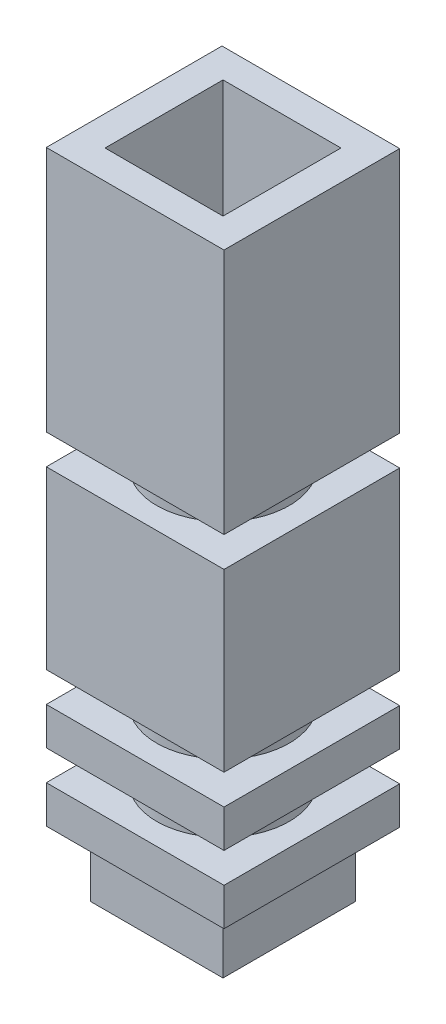
ISO-10303-21;
HEADER;
FILE_DESCRIPTION(('STEP AP214'),'2;1');
FILE_NAME('part.step','',(''),(''),'','','');
FILE_SCHEMA(('AUTOMOTIVE_DESIGN { 1 0 10303 214 1 1 1 1 }'));
ENDSEC;
DATA;
#1=APPLICATION_CONTEXT('core data for automotive mechanical design processes');
#2=APPLICATION_PROTOCOL_DEFINITION('international standard','automotive_design',2000,#1);
#3=PRODUCT_CONTEXT('',#1,'mechanical');
#4=PRODUCT('Part','Part','',(#3));
#5=PRODUCT_RELATED_PRODUCT_CATEGORY('part','',(#4));
#6=PRODUCT_DEFINITION_FORMATION('','',#4);
#7=PRODUCT_DEFINITION_CONTEXT('part definition',#1,'design');
#8=PRODUCT_DEFINITION('design','',#6,#7);
#9=PRODUCT_DEFINITION_SHAPE('','',#8);
#10=(LENGTH_UNIT() NAMED_UNIT(*) SI_UNIT(.MILLI.,.METRE.));
#11=(NAMED_UNIT(*) PLANE_ANGLE_UNIT() SI_UNIT($,.RADIAN.));
#12=(NAMED_UNIT(*) SI_UNIT($,.STERADIAN.) SOLID_ANGLE_UNIT());
#13=UNCERTAINTY_MEASURE_WITH_UNIT(LENGTH_MEASURE(1.E-05),#10,'distance_accuracy_value','');
#14=(GEOMETRIC_REPRESENTATION_CONTEXT(3) GLOBAL_UNCERTAINTY_ASSIGNED_CONTEXT((#13)) GLOBAL_UNIT_ASSIGNED_CONTEXT((#10,
#11,#12)) REPRESENTATION_CONTEXT('',''));
#15=CARTESIAN_POINT('',(0.,0.,0.));
#16=DIRECTION('',(0.,0.,1.));
#17=DIRECTION('',(1.,0.,0.));
#18=AXIS2_PLACEMENT_3D('',#15,#16,#17);
#19=CARTESIAN_POINT('',(0.,3.27659999999999,4.445));
#20=DIRECTION('',(0.,1.,0.));
#21=DIRECTION('',(0.,0.,1.));
#22=AXIS2_PLACEMENT_3D('',#19,#20,#21);
#23=PLANE('',#22);
#24=DIRECTION('',(1.,0.,0.));
#25=VECTOR('',#24,1.);
#26=CARTESIAN_POINT('',(0.,3.27659999999999,-4.445));
#27=LINE('',#26,#25);
#28=CARTESIAN_POINT('',(-4.49580000000001,3.27659999999999,-4.445));
#29=VERTEX_POINT('',#28);
#30=CARTESIAN_POINT('',(4.49579999999999,3.27659999999999,-4.445));
#31=VERTEX_POINT('',#30);
#32=EDGE_CURVE('E378',#29,#31,#27,.T.);
#33=ORIENTED_EDGE('',*,*,#32,.T.);
#34=DIRECTION('',(0.,0.,-1.));
#35=VECTOR('',#34,1.);
#36=CARTESIAN_POINT('',(4.49579999999999,3.27659999999999,4.445));
#37=LINE('',#36,#35);
#38=CARTESIAN_POINT('',(4.49579999999999,3.27659999999999,4.445));
#39=VERTEX_POINT('',#38);
#40=EDGE_CURVE('E385',#39,#31,#37,.T.);
#41=ORIENTED_EDGE('',*,*,#40,.F.);
#42=DIRECTION('',(1.,0.,0.));
#43=VECTOR('',#42,1.);
#44=CARTESIAN_POINT('',(0.,3.27659999999999,4.445));
#45=LINE('',#44,#43);
#46=CARTESIAN_POINT('',(-4.49580000000001,3.27659999999999,4.445));
#47=VERTEX_POINT('',#46);
#48=EDGE_CURVE('E383',#47,#39,#45,.T.);
#49=ORIENTED_EDGE('',*,*,#48,.F.);
#50=DIRECTION('',(0.,0.,-1.));
#51=VECTOR('',#50,1.);
#52=CARTESIAN_POINT('',(-4.49580000000001,3.27659999999999,4.445));
#53=LINE('',#52,#51);
#54=EDGE_CURVE('E396',#47,#29,#53,.T.);
#55=ORIENTED_EDGE('',*,*,#54,.T.);
#56=EDGE_LOOP('',(#33,#41,#49,#55));
#57=FACE_BOUND('',#56,.T.);
#58=DIRECTION('',(1.,0.,0.));
#59=VECTOR('',#58,1.);
#60=CARTESIAN_POINT('',(0.,3.27659999999999,-3.3528));
#61=LINE('',#60,#59);
#62=CARTESIAN_POINT('',(-3.3528,3.27659999999999,-3.3528));
#63=VERTEX_POINT('',#62);
#64=CARTESIAN_POINT('',(3.3528,3.27659999999999,-3.3528));
#65=VERTEX_POINT('',#64);
#66=EDGE_CURVE('E60',#63,#65,#61,.T.);
#67=ORIENTED_EDGE('',*,*,#66,.F.);
#68=DIRECTION('',(0.,0.,-1.));
#69=VECTOR('',#68,1.);
#70=CARTESIAN_POINT('',(-3.3528,3.27659999999999,3.3528));
#71=LINE('',#70,#69);
#72=CARTESIAN_POINT('',(-3.3528,3.27659999999999,3.3528));
#73=VERTEX_POINT('',#72);
#74=EDGE_CURVE('E264',#73,#63,#71,.T.);
#75=ORIENTED_EDGE('',*,*,#74,.F.);
#76=DIRECTION('',(1.,0.,0.));
#77=VECTOR('',#76,1.);
#78=CARTESIAN_POINT('',(0.,3.27659999999999,3.3528));
#79=LINE('',#78,#77);
#80=CARTESIAN_POINT('',(3.3528,3.27659999999999,3.3528));
#81=VERTEX_POINT('',#80);
#82=EDGE_CURVE('E245',#73,#81,#79,.T.);
#83=ORIENTED_EDGE('',*,*,#82,.T.);
#84=DIRECTION('',(0.,0.,-1.));
#85=VECTOR('',#84,1.);
#86=CARTESIAN_POINT('',(3.3528,3.27659999999999,3.3528));
#87=LINE('',#86,#85);
#88=EDGE_CURVE('E266',#81,#65,#87,.T.);
#89=ORIENTED_EDGE('',*,*,#88,.T.);
#90=EDGE_LOOP('',(#67,#75,#83,#89));
#91=FACE_BOUND('',#90,.T.);
#92=ADVANCED_FACE('F35',(#57,#91),#23,.F.);
#93=CARTESIAN_POINT('',(4.49579999999999,0.,4.445));
#94=DIRECTION('',(1.,0.,0.));
#95=DIRECTION('',(0.,0.,-1.));
#96=AXIS2_PLACEMENT_3D('',#93,#94,#95);
#97=PLANE('',#96);
#98=DIRECTION('',(0.,-1.,0.));
#99=VECTOR('',#98,1.);
#100=CARTESIAN_POINT('',(4.49579999999999,0.,-4.445));
#101=LINE('',#100,#99);
#102=CARTESIAN_POINT('',(4.49579999999999,5.18159999999999,-4.445));
#103=VERTEX_POINT('',#102);
#104=EDGE_CURVE('E373',#103,#31,#101,.T.);
#105=ORIENTED_EDGE('',*,*,#104,.F.);
#106=DIRECTION('',(0.,0.,-1.));
#107=VECTOR('',#106,1.);
#108=CARTESIAN_POINT('',(4.49579999999999,5.18159999999999,4.445));
#109=LINE('',#108,#107);
#110=CARTESIAN_POINT('',(4.49579999999999,5.18159999999999,4.445));
#111=VERTEX_POINT('',#110);
#112=EDGE_CURVE('E39',#111,#103,#109,.T.);
#113=ORIENTED_EDGE('',*,*,#112,.F.);
#114=DIRECTION('',(0.,-1.,0.));
#115=VECTOR('',#114,1.);
#116=CARTESIAN_POINT('',(4.49579999999999,0.,4.445));
#117=LINE('',#116,#115);
#118=EDGE_CURVE('E374',#111,#39,#117,.T.);
#119=ORIENTED_EDGE('',*,*,#118,.T.);
#120=ORIENTED_EDGE('',*,*,#40,.T.);
#121=EDGE_LOOP('',(#105,#113,#119,#120));
#122=FACE_BOUND('',#121,.T.);
#123=ADVANCED_FACE('F37',(#122),#97,.T.);
#124=CARTESIAN_POINT('',(0.,5.18159999999999,4.445));
#125=DIRECTION('',(0.,1.,0.));
#126=DIRECTION('',(-1.,0.,0.));
#127=AXIS2_PLACEMENT_3D('',#124,#125,#126);
#128=PLANE('',#127);
#129=CARTESIAN_POINT('',(0.,5.18159999999996,0.));
#130=DIRECTION('',(0.,1.,0.));
#131=DIRECTION('',(-1.,0.,0.));
#132=AXIS2_PLACEMENT_3D('',#129,#130,#131);
#133=CIRCLE('',#132,3.35279999999999);
#134=CARTESIAN_POINT('',(-3.3528,5.18159999999999,0.));
#135=VERTEX_POINT('',#134);
#136=EDGE_CURVE('E335',#135,#135,#133,.T.);
#137=ORIENTED_EDGE('',*,*,#136,.F.);
#138=EDGE_LOOP('',(#137));
#139=FACE_BOUND('',#138,.T.);
#140=DIRECTION('',(1.,0.,0.));
#141=VECTOR('',#140,1.);
#142=CARTESIAN_POINT('',(0.,5.18159999999999,-4.445));
#143=LINE('',#142,#141);
#144=CARTESIAN_POINT('',(-4.49580000000001,5.18159999999999,-4.445));
#145=VERTEX_POINT('',#144);
#146=EDGE_CURVE('E388',#145,#103,#143,.T.);
#147=ORIENTED_EDGE('',*,*,#146,.F.);
#148=DIRECTION('',(0.,0.,-1.));
#149=VECTOR('',#148,1.);
#150=CARTESIAN_POINT('',(-4.49580000000001,5.18159999999999,4.445));
#151=LINE('',#150,#149);
#152=CARTESIAN_POINT('',(-4.49580000000001,5.18159999999999,4.445));
#153=VERTEX_POINT('',#152);
#154=EDGE_CURVE('E398',#153,#145,#151,.T.);
#155=ORIENTED_EDGE('',*,*,#154,.F.);
#156=DIRECTION('',(1.,0.,0.));
#157=VECTOR('',#156,1.);
#158=CARTESIAN_POINT('',(0.,5.18159999999999,4.445));
#159=LINE('',#158,#157);
#160=EDGE_CURVE('E377',#153,#111,#159,.T.);
#161=ORIENTED_EDGE('',*,*,#160,.T.);
#162=ORIENTED_EDGE('',*,*,#112,.T.);
#163=EDGE_LOOP('',(#147,#155,#161,#162));
#164=FACE_BOUND('',#163,.T.);
#165=ADVANCED_FACE('F405',(#139,#164),#128,.T.);
#166=CARTESIAN_POINT('',(-4.49580000000001,0.,4.445));
#167=DIRECTION('',(1.,0.,0.));
#168=DIRECTION('',(0.,0.,-1.));
#169=AXIS2_PLACEMENT_3D('',#166,#167,#168);
#170=PLANE('',#169);
#171=DIRECTION('',(0.,-1.,0.));
#172=VECTOR('',#171,1.);
#173=CARTESIAN_POINT('',(-4.49580000000001,0.,-4.445));
#174=LINE('',#173,#172);
#175=EDGE_CURVE('E391',#145,#29,#174,.T.);
#176=ORIENTED_EDGE('',*,*,#175,.T.);
#177=ORIENTED_EDGE('',*,*,#54,.F.);
#178=DIRECTION('',(0.,-1.,0.));
#179=VECTOR('',#178,1.);
#180=CARTESIAN_POINT('',(-4.49580000000001,0.,4.445));
#181=LINE('',#180,#179);
#182=EDGE_CURVE('E381',#153,#47,#181,.T.);
#183=ORIENTED_EDGE('',*,*,#182,.F.);
#184=ORIENTED_EDGE('',*,*,#154,.T.);
#185=EDGE_LOOP('',(#176,#177,#183,#184));
#186=FACE_BOUND('',#185,.T.);
#187=ADVANCED_FACE('F414',(#186),#170,.F.);
#188=CARTESIAN_POINT('',(0.,0.,4.445));
#189=DIRECTION('',(0.,0.,1.));
#190=DIRECTION('',(1.,0.,0.));
#191=AXIS2_PLACEMENT_3D('',#188,#189,#190);
#192=PLANE('',#191);
#193=ORIENTED_EDGE('',*,*,#118,.F.);
#194=ORIENTED_EDGE('',*,*,#160,.F.);
#195=ORIENTED_EDGE('',*,*,#182,.T.);
#196=ORIENTED_EDGE('',*,*,#48,.T.);
#197=EDGE_LOOP('',(#193,#194,#195,#196));
#198=FACE_BOUND('',#197,.T.);
#199=ADVANCED_FACE('F419',(#198),#192,.T.);
#200=CARTESIAN_POINT('',(0.,0.,-4.445));
#201=DIRECTION('',(0.,0.,1.));
#202=DIRECTION('',(1.,0.,0.));
#203=AXIS2_PLACEMENT_3D('',#200,#201,#202);
#204=PLANE('',#203);
#205=ORIENTED_EDGE('',*,*,#104,.T.);
#206=ORIENTED_EDGE('',*,*,#32,.F.);
#207=ORIENTED_EDGE('',*,*,#175,.F.);
#208=ORIENTED_EDGE('',*,*,#146,.T.);
#209=EDGE_LOOP('',(#205,#206,#207,#208));
#210=FACE_BOUND('',#209,.T.);
#211=ADVANCED_FACE('F412',(#210),#204,.F.);
#212=CARTESIAN_POINT('',(0.,6.70559999999999,0.));
#213=DIRECTION('',(0.,1.,0.));
#214=DIRECTION('',(-1.,0.,0.));
#215=AXIS2_PLACEMENT_3D('',#212,#213,#214);
#216=CYLINDRICAL_SURFACE('',#215,3.3528);
#217=ORIENTED_EDGE('',*,*,#136,.T.);
#218=EDGE_LOOP('',(#217));
#219=FACE_BOUND('',#218,.T.);
#220=CARTESIAN_POINT('',(0.,6.70559999999997,0.));
#221=DIRECTION('',(0.,1.,0.));
#222=DIRECTION('',(-1.,0.,0.));
#223=AXIS2_PLACEMENT_3D('',#220,#221,#222);
#224=CIRCLE('',#223,3.3528);
#225=CARTESIAN_POINT('',(-3.3528,6.70559999999999,0.));
#226=VERTEX_POINT('',#225);
#227=EDGE_CURVE('E368',#226,#226,#224,.T.);
#228=ORIENTED_EDGE('',*,*,#227,.F.);
#229=EDGE_LOOP('',(#228));
#230=FACE_BOUND('',#229,.T.);
#231=ADVANCED_FACE('F426',(#219,#230),#216,.T.);
#232=CARTESIAN_POINT('',(4.4958,0.,4.445));
#233=DIRECTION('',(1.,0.,0.));
#234=DIRECTION('',(0.,0.,-1.));
#235=AXIS2_PLACEMENT_3D('',#232,#233,#234);
#236=PLANE('',#235);
#237=DIRECTION('',(0.,-1.,0.));
#238=VECTOR('',#237,1.);
#239=CARTESIAN_POINT('',(4.4958,0.,-4.445));
#240=LINE('',#239,#238);
#241=CARTESIAN_POINT('',(4.4958,8.61059999999999,-4.445));
#242=VERTEX_POINT('',#241);
#243=CARTESIAN_POINT('',(4.4958,6.70559999999999,-4.445));
#244=VERTEX_POINT('',#243);
#245=EDGE_CURVE('E338',#242,#244,#240,.T.);
#246=ORIENTED_EDGE('',*,*,#245,.F.);
#247=DIRECTION('',(0.,0.,-1.));
#248=VECTOR('',#247,1.);
#249=CARTESIAN_POINT('',(4.4958,8.61059999999999,4.445));
#250=LINE('',#249,#248);
#251=CARTESIAN_POINT('',(4.4958,8.61059999999999,4.445));
#252=VERTEX_POINT('',#251);
#253=EDGE_CURVE('E366',#252,#242,#250,.T.);
#254=ORIENTED_EDGE('',*,*,#253,.F.);
#255=DIRECTION('',(0.,-1.,0.));
#256=VECTOR('',#255,1.);
#257=CARTESIAN_POINT('',(4.4958,0.,4.445));
#258=LINE('',#257,#256);
#259=CARTESIAN_POINT('',(4.4958,6.70559999999999,4.445));
#260=VERTEX_POINT('',#259);
#261=EDGE_CURVE('E339',#252,#260,#258,.T.);
#262=ORIENTED_EDGE('',*,*,#261,.T.);
#263=DIRECTION('',(0.,0.,-1.));
#264=VECTOR('',#263,1.);
#265=CARTESIAN_POINT('',(4.4958,6.70559999999999,4.445));
#266=LINE('',#265,#264);
#267=EDGE_CURVE('E350',#260,#244,#266,.T.);
#268=ORIENTED_EDGE('',*,*,#267,.T.);
#269=EDGE_LOOP('',(#246,#254,#262,#268));
#270=FACE_BOUND('',#269,.T.);
#271=ADVANCED_FACE('F443',(#270),#236,.T.);
#272=CARTESIAN_POINT('',(0.,8.61059999999999,4.445));
#273=DIRECTION('',(0.,1.,0.));
#274=DIRECTION('',(0.,0.,1.));
#275=AXIS2_PLACEMENT_3D('',#272,#273,#274);
#276=PLANE('',#275);
#277=CARTESIAN_POINT('',(0.,8.6106,0.));
#278=DIRECTION('',(0.,1.,0.));
#279=DIRECTION('',(-1.,0.,0.));
#280=AXIS2_PLACEMENT_3D('',#277,#278,#279);
#281=CIRCLE('',#280,3.3528);
#282=CARTESIAN_POINT('',(-3.3528,8.61059999999999,0.));
#283=VERTEX_POINT('',#282);
#284=EDGE_CURVE('E44',#283,#283,#281,.T.);
#285=ORIENTED_EDGE('',*,*,#284,.F.);
#286=EDGE_LOOP('',(#285));
#287=FACE_BOUND('',#286,.T.);
#288=DIRECTION('',(1.,0.,0.));
#289=VECTOR('',#288,1.);
#290=CARTESIAN_POINT('',(0.,8.61059999999999,-4.445));
#291=LINE('',#290,#289);
#292=CARTESIAN_POINT('',(-4.4958,8.61059999999999,-4.445));
#293=VERTEX_POINT('',#292);
#294=EDGE_CURVE('E353',#293,#242,#291,.T.);
#295=ORIENTED_EDGE('',*,*,#294,.F.);
#296=DIRECTION('',(0.,0.,-1.));
#297=VECTOR('',#296,1.);
#298=CARTESIAN_POINT('',(-4.4958,8.61059999999999,4.445));
#299=LINE('',#298,#297);
#300=CARTESIAN_POINT('',(-4.4958,8.61059999999999,4.445));
#301=VERTEX_POINT('',#300);
#302=EDGE_CURVE('E364',#301,#293,#299,.T.);
#303=ORIENTED_EDGE('',*,*,#302,.F.);
#304=DIRECTION('',(1.,0.,0.));
#305=VECTOR('',#304,1.);
#306=CARTESIAN_POINT('',(0.,8.61059999999999,4.445));
#307=LINE('',#306,#305);
#308=EDGE_CURVE('E342',#301,#252,#307,.T.);
#309=ORIENTED_EDGE('',*,*,#308,.T.);
#310=ORIENTED_EDGE('',*,*,#253,.T.);
#311=EDGE_LOOP('',(#295,#303,#309,#310));
#312=FACE_BOUND('',#311,.T.);
#313=ADVANCED_FACE('F466',(#287,#312),#276,.T.);
#314=CARTESIAN_POINT('',(-4.4958,0.,4.445));
#315=DIRECTION('',(1.,0.,0.));
#316=DIRECTION('',(0.,0.,-1.));
#317=AXIS2_PLACEMENT_3D('',#314,#315,#316);
#318=PLANE('',#317);
#319=DIRECTION('',(0.,-1.,0.));
#320=VECTOR('',#319,1.);
#321=CARTESIAN_POINT('',(-4.4958,0.,-4.445));
#322=LINE('',#321,#320);
#323=CARTESIAN_POINT('',(-4.4958,6.70559999999999,-4.445));
#324=VERTEX_POINT('',#323);
#325=EDGE_CURVE('E356',#293,#324,#322,.T.);
#326=ORIENTED_EDGE('',*,*,#325,.T.);
#327=DIRECTION('',(0.,0.,-1.));
#328=VECTOR('',#327,1.);
#329=CARTESIAN_POINT('',(-4.4958,6.70559999999999,4.445));
#330=LINE('',#329,#328);
#331=CARTESIAN_POINT('',(-4.4958,6.70559999999999,4.445));
#332=VERTEX_POINT('',#331);
#333=EDGE_CURVE('E361',#332,#324,#330,.T.);
#334=ORIENTED_EDGE('',*,*,#333,.F.);
#335=DIRECTION('',(0.,-1.,0.));
#336=VECTOR('',#335,1.);
#337=CARTESIAN_POINT('',(-4.4958,0.,4.445));
#338=LINE('',#337,#336);
#339=EDGE_CURVE('E346',#301,#332,#338,.T.);
#340=ORIENTED_EDGE('',*,*,#339,.F.);
#341=ORIENTED_EDGE('',*,*,#302,.T.);
#342=EDGE_LOOP('',(#326,#334,#340,#341));
#343=FACE_BOUND('',#342,.T.);
#344=ADVANCED_FACE('F450',(#343),#318,.F.);
#345=CARTESIAN_POINT('',(0.,6.70559999999999,4.445));
#346=DIRECTION('',(0.,1.,0.));
#347=DIRECTION('',(-1.,0.,0.));
#348=AXIS2_PLACEMENT_3D('',#345,#346,#347);
#349=PLANE('',#348);
#350=ORIENTED_EDGE('',*,*,#227,.T.);
#351=EDGE_LOOP('',(#350));
#352=FACE_BOUND('',#351,.T.);
#353=DIRECTION('',(1.,0.,0.));
#354=VECTOR('',#353,1.);
#355=CARTESIAN_POINT('',(0.,6.70559999999999,-4.445));
#356=LINE('',#355,#354);
#357=EDGE_CURVE('E343',#324,#244,#356,.T.);
#358=ORIENTED_EDGE('',*,*,#357,.T.);
#359=ORIENTED_EDGE('',*,*,#267,.F.);
#360=DIRECTION('',(1.,0.,0.));
#361=VECTOR('',#360,1.);
#362=CARTESIAN_POINT('',(0.,6.70559999999999,4.445));
#363=LINE('',#362,#361);
#364=EDGE_CURVE('E348',#332,#260,#363,.T.);
#365=ORIENTED_EDGE('',*,*,#364,.F.);
#366=ORIENTED_EDGE('',*,*,#333,.T.);
#367=EDGE_LOOP('',(#358,#359,#365,#366));
#368=FACE_BOUND('',#367,.T.);
#369=ADVANCED_FACE('F446',(#352,#368),#349,.F.);
#370=CARTESIAN_POINT('',(0.,0.,4.445));
#371=DIRECTION('',(0.,0.,1.));
#372=DIRECTION('',(1.,0.,0.));
#373=AXIS2_PLACEMENT_3D('',#370,#371,#372);
#374=PLANE('',#373);
#375=ORIENTED_EDGE('',*,*,#261,.F.);
#376=ORIENTED_EDGE('',*,*,#308,.F.);
#377=ORIENTED_EDGE('',*,*,#339,.T.);
#378=ORIENTED_EDGE('',*,*,#364,.T.);
#379=EDGE_LOOP('',(#375,#376,#377,#378));
#380=FACE_BOUND('',#379,.T.);
#381=ADVANCED_FACE('F449',(#380),#374,.T.);
#382=CARTESIAN_POINT('',(0.,0.,-4.445));
#383=DIRECTION('',(0.,0.,1.));
#384=DIRECTION('',(1.,0.,0.));
#385=AXIS2_PLACEMENT_3D('',#382,#383,#384);
#386=PLANE('',#385);
#387=ORIENTED_EDGE('',*,*,#245,.T.);
#388=ORIENTED_EDGE('',*,*,#357,.F.);
#389=ORIENTED_EDGE('',*,*,#325,.F.);
#390=ORIENTED_EDGE('',*,*,#294,.T.);
#391=EDGE_LOOP('',(#387,#388,#389,#390));
#392=FACE_BOUND('',#391,.T.);
#393=ADVANCED_FACE('F459',(#392),#386,.F.);
#394=CARTESIAN_POINT('',(0.,10.1346,0.));
#395=DIRECTION('',(0.,1.,0.));
#396=DIRECTION('',(-1.,0.,0.));
#397=AXIS2_PLACEMENT_3D('',#394,#395,#396);
#398=CYLINDRICAL_SURFACE('',#397,3.3528);
#399=ORIENTED_EDGE('',*,*,#284,.T.);
#400=EDGE_LOOP('',(#399));
#401=FACE_BOUND('',#400,.T.);
#402=CARTESIAN_POINT('',(0.,10.1346,0.));
#403=DIRECTION('',(0.,1.,0.));
#404=DIRECTION('',(-1.,0.,0.));
#405=AXIS2_PLACEMENT_3D('',#402,#403,#404);
#406=CIRCLE('',#405,3.3528);
#407=CARTESIAN_POINT('',(-3.3528,10.1346,0.));
#408=VERTEX_POINT('',#407);
#409=EDGE_CURVE('E332',#408,#408,#406,.T.);
#410=ORIENTED_EDGE('',*,*,#409,.F.);
#411=EDGE_LOOP('',(#410));
#412=FACE_BOUND('',#411,.T.);
#413=ADVANCED_FACE('F499',(#401,#412),#398,.T.);
#414=CARTESIAN_POINT('',(4.4958,0.,4.445));
#415=DIRECTION('',(1.,0.,0.));
#416=DIRECTION('',(0.,0.,-1.));
#417=AXIS2_PLACEMENT_3D('',#414,#415,#416);
#418=PLANE('',#417);
#419=DIRECTION('',(0.,-1.,0.));
#420=VECTOR('',#419,1.);
#421=CARTESIAN_POINT('',(4.4958,0.,-4.445));
#422=LINE('',#421,#420);
#423=CARTESIAN_POINT('',(4.4958,19.0246,-4.445));
#424=VERTEX_POINT('',#423);
#425=CARTESIAN_POINT('',(4.4958,10.1346,-4.445));
#426=VERTEX_POINT('',#425);
#427=EDGE_CURVE('E302',#424,#426,#422,.T.);
#428=ORIENTED_EDGE('',*,*,#427,.F.);
#429=DIRECTION('',(0.,0.,-1.));
#430=VECTOR('',#429,1.);
#431=CARTESIAN_POINT('',(4.4958,19.0246,4.445));
#432=LINE('',#431,#430);
#433=CARTESIAN_POINT('',(4.4958,19.0246,4.445));
#434=VERTEX_POINT('',#433);
#435=EDGE_CURVE('E330',#434,#424,#432,.T.);
#436=ORIENTED_EDGE('',*,*,#435,.F.);
#437=DIRECTION('',(0.,-1.,0.));
#438=VECTOR('',#437,1.);
#439=CARTESIAN_POINT('',(4.4958,0.,4.445));
#440=LINE('',#439,#438);
#441=CARTESIAN_POINT('',(4.4958,10.1346,4.445));
#442=VERTEX_POINT('',#441);
#443=EDGE_CURVE('E303',#434,#442,#440,.T.);
#444=ORIENTED_EDGE('',*,*,#443,.T.);
#445=DIRECTION('',(0.,0.,-1.));
#446=VECTOR('',#445,1.);
#447=CARTESIAN_POINT('',(4.4958,10.1346,4.445));
#448=LINE('',#447,#446);
#449=EDGE_CURVE('E314',#442,#426,#448,.T.);
#450=ORIENTED_EDGE('',*,*,#449,.T.);
#451=EDGE_LOOP('',(#428,#436,#444,#450));
#452=FACE_BOUND('',#451,.T.);
#453=ADVANCED_FACE('F504',(#452),#418,.T.);
#454=CARTESIAN_POINT('',(0.,19.0246,4.445));
#455=DIRECTION('',(0.,1.,0.));
#456=DIRECTION('',(-1.,0.,0.));
#457=AXIS2_PLACEMENT_3D('',#454,#455,#456);
#458=PLANE('',#457);
#459=CARTESIAN_POINT('',(0.,19.0246,0.));
#460=DIRECTION('',(0.,1.,0.));
#461=DIRECTION('',(-1.,0.,0.));
#462=AXIS2_PLACEMENT_3D('',#459,#460,#461);
#463=CIRCLE('',#462,3.35280000000001);
#464=CARTESIAN_POINT('',(-3.35280000000001,19.0246,0.));
#465=VERTEX_POINT('',#464);
#466=EDGE_CURVE('E11',#465,#465,#463,.T.);
#467=ORIENTED_EDGE('',*,*,#466,.F.);
#468=EDGE_LOOP('',(#467));
#469=FACE_BOUND('',#468,.T.);
#470=DIRECTION('',(1.,0.,0.));
#471=VECTOR('',#470,1.);
#472=CARTESIAN_POINT('',(0.,19.0246,-4.445));
#473=LINE('',#472,#471);
#474=CARTESIAN_POINT('',(-4.4958,19.0246,-4.445));
#475=VERTEX_POINT('',#474);
#476=EDGE_CURVE('E317',#475,#424,#473,.T.);
#477=ORIENTED_EDGE('',*,*,#476,.F.);
#478=DIRECTION('',(0.,0.,-1.));
#479=VECTOR('',#478,1.);
#480=CARTESIAN_POINT('',(-4.4958,19.0246,4.445));
#481=LINE('',#480,#479);
#482=CARTESIAN_POINT('',(-4.4958,19.0246,4.445));
#483=VERTEX_POINT('',#482);
#484=EDGE_CURVE('E328',#483,#475,#481,.T.);
#485=ORIENTED_EDGE('',*,*,#484,.F.);
#486=DIRECTION('',(1.,0.,0.));
#487=VECTOR('',#486,1.);
#488=CARTESIAN_POINT('',(0.,19.0246,4.445));
#489=LINE('',#488,#487);
#490=EDGE_CURVE('E306',#483,#434,#489,.T.);
#491=ORIENTED_EDGE('',*,*,#490,.T.);
#492=ORIENTED_EDGE('',*,*,#435,.T.);
#493=EDGE_LOOP('',(#477,#485,#491,#492));
#494=FACE_BOUND('',#493,.T.);
#495=ADVANCED_FACE('F514',(#469,#494),#458,.T.);
#496=CARTESIAN_POINT('',(-4.4958,0.,4.445));
#497=DIRECTION('',(1.,0.,0.));
#498=DIRECTION('',(0.,0.,-1.));
#499=AXIS2_PLACEMENT_3D('',#496,#497,#498);
#500=PLANE('',#499);
#501=DIRECTION('',(0.,-1.,0.));
#502=VECTOR('',#501,1.);
#503=CARTESIAN_POINT('',(-4.4958,0.,-4.445));
#504=LINE('',#503,#502);
#505=CARTESIAN_POINT('',(-4.4958,10.1346,-4.445));
#506=VERTEX_POINT('',#505);
#507=EDGE_CURVE('E320',#475,#506,#504,.T.);
#508=ORIENTED_EDGE('',*,*,#507,.T.);
#509=DIRECTION('',(0.,0.,-1.));
#510=VECTOR('',#509,1.);
#511=CARTESIAN_POINT('',(-4.4958,10.1346,4.445));
#512=LINE('',#511,#510);
#513=CARTESIAN_POINT('',(-4.4958,10.1346,4.445));
#514=VERTEX_POINT('',#513);
#515=EDGE_CURVE('E325',#514,#506,#512,.T.);
#516=ORIENTED_EDGE('',*,*,#515,.F.);
#517=DIRECTION('',(0.,-1.,0.));
#518=VECTOR('',#517,1.);
#519=CARTESIAN_POINT('',(-4.4958,0.,4.445));
#520=LINE('',#519,#518);
#521=EDGE_CURVE('E310',#483,#514,#520,.T.);
#522=ORIENTED_EDGE('',*,*,#521,.F.);
#523=ORIENTED_EDGE('',*,*,#484,.T.);
#524=EDGE_LOOP('',(#508,#516,#522,#523));
#525=FACE_BOUND('',#524,.T.);
#526=ADVANCED_FACE('F522',(#525),#500,.F.);
#527=CARTESIAN_POINT('',(0.,10.1346,4.445));
#528=DIRECTION('',(0.,1.,0.));
#529=DIRECTION('',(0.,0.,1.));
#530=AXIS2_PLACEMENT_3D('',#527,#528,#529);
#531=PLANE('',#530);
#532=ORIENTED_EDGE('',*,*,#409,.T.);
#533=EDGE_LOOP('',(#532));
#534=FACE_BOUND('',#533,.T.);
#535=DIRECTION('',(1.,0.,0.));
#536=VECTOR('',#535,1.);
#537=CARTESIAN_POINT('',(0.,10.1346,-4.445));
#538=LINE('',#537,#536);
#539=EDGE_CURVE('E307',#506,#426,#538,.T.);
#540=ORIENTED_EDGE('',*,*,#539,.T.);
#541=ORIENTED_EDGE('',*,*,#449,.F.);
#542=DIRECTION('',(1.,0.,0.));
#543=VECTOR('',#542,1.);
#544=CARTESIAN_POINT('',(0.,10.1346,4.445));
#545=LINE('',#544,#543);
#546=EDGE_CURVE('E312',#514,#442,#545,.T.);
#547=ORIENTED_EDGE('',*,*,#546,.F.);
#548=ORIENTED_EDGE('',*,*,#515,.T.);
#549=EDGE_LOOP('',(#540,#541,#547,#548));
#550=FACE_BOUND('',#549,.T.);
#551=ADVANCED_FACE('F527',(#534,#550),#531,.F.);
#552=CARTESIAN_POINT('',(0.,0.,4.445));
#553=DIRECTION('',(0.,0.,1.));
#554=DIRECTION('',(1.,0.,0.));
#555=AXIS2_PLACEMENT_3D('',#552,#553,#554);
#556=PLANE('',#555);
#557=ORIENTED_EDGE('',*,*,#443,.F.);
#558=ORIENTED_EDGE('',*,*,#490,.F.);
#559=ORIENTED_EDGE('',*,*,#521,.T.);
#560=ORIENTED_EDGE('',*,*,#546,.T.);
#561=EDGE_LOOP('',(#557,#558,#559,#560));
#562=FACE_BOUND('',#561,.T.);
#563=ADVANCED_FACE('F539',(#562),#556,.T.);
#564=CARTESIAN_POINT('',(0.,0.,-4.445));
#565=DIRECTION('',(0.,0.,1.));
#566=DIRECTION('',(1.,0.,0.));
#567=AXIS2_PLACEMENT_3D('',#564,#565,#566);
#568=PLANE('',#567);
#569=ORIENTED_EDGE('',*,*,#427,.T.);
#570=ORIENTED_EDGE('',*,*,#539,.F.);
#571=ORIENTED_EDGE('',*,*,#507,.F.);
#572=ORIENTED_EDGE('',*,*,#476,.T.);
#573=EDGE_LOOP('',(#569,#570,#571,#572));
#574=FACE_BOUND('',#573,.T.);
#575=ADVANCED_FACE('F549',(#574),#568,.F.);
#576=CARTESIAN_POINT('',(0.,20.5486,0.));
#577=DIRECTION('',(0.,1.,0.));
#578=DIRECTION('',(-1.,0.,0.));
#579=AXIS2_PLACEMENT_3D('',#576,#577,#578);
#580=CYLINDRICAL_SURFACE('',#579,3.35280000000001);
#581=ORIENTED_EDGE('',*,*,#466,.T.);
#582=EDGE_LOOP('',(#581));
#583=FACE_BOUND('',#582,.T.);
#584=CARTESIAN_POINT('',(0.,20.5486,0.));
#585=DIRECTION('',(0.,1.,0.));
#586=DIRECTION('',(-1.,0.,0.));
#587=AXIS2_PLACEMENT_3D('',#584,#585,#586);
#588=CIRCLE('',#587,3.35280000000001);
#589=CARTESIAN_POINT('',(-3.35280000000001,20.5486,0.));
#590=VERTEX_POINT('',#589);
#591=EDGE_CURVE('E298',#590,#590,#588,.T.);
#592=ORIENTED_EDGE('',*,*,#591,.F.);
#593=EDGE_LOOP('',(#592));
#594=FACE_BOUND('',#593,.T.);
#595=ADVANCED_FACE('F559',(#583,#594),#580,.T.);
#596=CARTESIAN_POINT('',(4.4958,0.,4.445));
#597=DIRECTION('',(1.,0.,0.));
#598=DIRECTION('',(0.,0.,-1.));
#599=AXIS2_PLACEMENT_3D('',#596,#597,#598);
#600=PLANE('',#599);
#601=DIRECTION('',(0.,-1.,0.));
#602=VECTOR('',#601,1.);
#603=CARTESIAN_POINT('',(4.4958,0.,-4.445));
#604=LINE('',#603,#602);
#605=CARTESIAN_POINT('',(4.4958,33.02,-4.445));
#606=VERTEX_POINT('',#605);
#607=CARTESIAN_POINT('',(4.4958,20.5486,-4.445));
#608=VERTEX_POINT('',#607);
#609=EDGE_CURVE('E269',#606,#608,#604,.T.);
#610=ORIENTED_EDGE('',*,*,#609,.F.);
#611=DIRECTION('',(0.,0.,-1.));
#612=VECTOR('',#611,1.);
#613=CARTESIAN_POINT('',(4.4958,33.02,4.445));
#614=LINE('',#613,#612);
#615=CARTESIAN_POINT('',(4.4958,33.02,4.445));
#616=VERTEX_POINT('',#615);
#617=EDGE_CURVE('E297',#616,#606,#614,.T.);
#618=ORIENTED_EDGE('',*,*,#617,.F.);
#619=DIRECTION('',(0.,-1.,0.));
#620=VECTOR('',#619,1.);
#621=CARTESIAN_POINT('',(4.4958,0.,4.445));
#622=LINE('',#621,#620);
#623=CARTESIAN_POINT('',(4.4958,20.5486,4.445));
#624=VERTEX_POINT('',#623);
#625=EDGE_CURVE('E270',#616,#624,#622,.T.);
#626=ORIENTED_EDGE('',*,*,#625,.T.);
#627=DIRECTION('',(0.,0.,-1.));
#628=VECTOR('',#627,1.);
#629=CARTESIAN_POINT('',(4.4958,20.5486,4.445));
#630=LINE('',#629,#628);
#631=EDGE_CURVE('E281',#624,#608,#630,.T.);
#632=ORIENTED_EDGE('',*,*,#631,.T.);
#633=EDGE_LOOP('',(#610,#618,#626,#632));
#634=FACE_BOUND('',#633,.T.);
#635=ADVANCED_FACE('F576',(#634),#600,.T.);
#636=CARTESIAN_POINT('',(0.,33.02,4.445));
#637=DIRECTION('',(0.,1.,0.));
#638=DIRECTION('',(0.,0.,1.));
#639=AXIS2_PLACEMENT_3D('',#636,#637,#638);
#640=PLANE('',#639);
#641=DIRECTION('',(0.,0.,-1.));
#642=VECTOR('',#641,1.);
#643=CARTESIAN_POINT('',(2.9845,33.02,2.9845));
#644=LINE('',#643,#642);
#645=CARTESIAN_POINT('',(2.9845,33.02,2.9845));
#646=VERTEX_POINT('',#645);
#647=CARTESIAN_POINT('',(2.9845,33.02,-2.9845));
#648=VERTEX_POINT('',#647);
#649=EDGE_CURVE('E52',#646,#648,#644,.T.);
#650=ORIENTED_EDGE('',*,*,#649,.F.);
#651=DIRECTION('',(1.,0.,0.));
#652=VECTOR('',#651,1.);
#653=CARTESIAN_POINT('',(-2.9845,33.02,2.9845));
#654=LINE('',#653,#652);
#655=CARTESIAN_POINT('',(-2.9845,33.02,2.9845));
#656=VERTEX_POINT('',#655);
#657=EDGE_CURVE('E220',#656,#646,#654,.T.);
#658=ORIENTED_EDGE('',*,*,#657,.F.);
#659=DIRECTION('',(0.,0.,1.));
#660=VECTOR('',#659,1.);
#661=CARTESIAN_POINT('',(-2.9845,33.02,2.9845));
#662=LINE('',#661,#660);
#663=CARTESIAN_POINT('',(-2.9845,33.02,-2.9845));
#664=VERTEX_POINT('',#663);
#665=EDGE_CURVE('E223',#664,#656,#662,.T.);
#666=ORIENTED_EDGE('',*,*,#665,.F.);
#667=DIRECTION('',(-1.,0.,0.));
#668=VECTOR('',#667,1.);
#669=CARTESIAN_POINT('',(-2.9845,33.02,-2.9845));
#670=LINE('',#669,#668);
#671=EDGE_CURVE('E232',#648,#664,#670,.T.);
#672=ORIENTED_EDGE('',*,*,#671,.F.);
#673=EDGE_LOOP('',(#650,#658,#666,#672));
#674=FACE_BOUND('',#673,.T.);
#675=DIRECTION('',(1.,0.,0.));
#676=VECTOR('',#675,1.);
#677=CARTESIAN_POINT('',(0.,33.02,-4.445));
#678=LINE('',#677,#676);
#679=CARTESIAN_POINT('',(-4.4958,33.02,-4.445));
#680=VERTEX_POINT('',#679);
#681=EDGE_CURVE('E284',#680,#606,#678,.T.);
#682=ORIENTED_EDGE('',*,*,#681,.F.);
#683=DIRECTION('',(0.,0.,-1.));
#684=VECTOR('',#683,1.);
#685=CARTESIAN_POINT('',(-4.4958,33.02,4.445));
#686=LINE('',#685,#684);
#687=CARTESIAN_POINT('',(-4.4958,33.02,4.445));
#688=VERTEX_POINT('',#687);
#689=EDGE_CURVE('E295',#688,#680,#686,.T.);
#690=ORIENTED_EDGE('',*,*,#689,.F.);
#691=DIRECTION('',(1.,0.,0.));
#692=VECTOR('',#691,1.);
#693=CARTESIAN_POINT('',(0.,33.02,4.445));
#694=LINE('',#693,#692);
#695=EDGE_CURVE('E273',#688,#616,#694,.T.);
#696=ORIENTED_EDGE('',*,*,#695,.T.);
#697=ORIENTED_EDGE('',*,*,#617,.T.);
#698=EDGE_LOOP('',(#682,#690,#696,#697));
#699=FACE_BOUND('',#698,.T.);
#700=ADVANCED_FACE('F586',(#674,#699),#640,.T.);
#701=CARTESIAN_POINT('',(-4.4958,0.,4.445));
#702=DIRECTION('',(1.,0.,0.));
#703=DIRECTION('',(0.,0.,-1.));
#704=AXIS2_PLACEMENT_3D('',#701,#702,#703);
#705=PLANE('',#704);
#706=DIRECTION('',(0.,-1.,0.));
#707=VECTOR('',#706,1.);
#708=CARTESIAN_POINT('',(-4.4958,0.,-4.445));
#709=LINE('',#708,#707);
#710=CARTESIAN_POINT('',(-4.4958,20.5486,-4.445));
#711=VERTEX_POINT('',#710);
#712=EDGE_CURVE('E287',#680,#711,#709,.T.);
#713=ORIENTED_EDGE('',*,*,#712,.T.);
#714=DIRECTION('',(0.,0.,-1.));
#715=VECTOR('',#714,1.);
#716=CARTESIAN_POINT('',(-4.4958,20.5486,4.445));
#717=LINE('',#716,#715);
#718=CARTESIAN_POINT('',(-4.4958,20.5486,4.445));
#719=VERTEX_POINT('',#718);
#720=EDGE_CURVE('E292',#719,#711,#717,.T.);
#721=ORIENTED_EDGE('',*,*,#720,.F.);
#722=DIRECTION('',(0.,-1.,0.));
#723=VECTOR('',#722,1.);
#724=CARTESIAN_POINT('',(-4.4958,0.,4.445));
#725=LINE('',#724,#723);
#726=EDGE_CURVE('E277',#688,#719,#725,.T.);
#727=ORIENTED_EDGE('',*,*,#726,.F.);
#728=ORIENTED_EDGE('',*,*,#689,.T.);
#729=EDGE_LOOP('',(#713,#721,#727,#728));
#730=FACE_BOUND('',#729,.T.);
#731=ADVANCED_FACE('F594',(#730),#705,.F.);
#732=CARTESIAN_POINT('',(0.,20.5486,4.445));
#733=DIRECTION('',(0.,1.,0.));
#734=DIRECTION('',(0.,0.,1.));
#735=AXIS2_PLACEMENT_3D('',#732,#733,#734);
#736=PLANE('',#735);
#737=ORIENTED_EDGE('',*,*,#591,.T.);
#738=EDGE_LOOP('',(#737));
#739=FACE_BOUND('',#738,.T.);
#740=DIRECTION('',(1.,0.,0.));
#741=VECTOR('',#740,1.);
#742=CARTESIAN_POINT('',(0.,20.5486,-4.445));
#743=LINE('',#742,#741);
#744=EDGE_CURVE('E274',#711,#608,#743,.T.);
#745=ORIENTED_EDGE('',*,*,#744,.T.);
#746=ORIENTED_EDGE('',*,*,#631,.F.);
#747=DIRECTION('',(1.,0.,0.));
#748=VECTOR('',#747,1.);
#749=CARTESIAN_POINT('',(0.,20.5486,4.445));
#750=LINE('',#749,#748);
#751=EDGE_CURVE('E279',#719,#624,#750,.T.);
#752=ORIENTED_EDGE('',*,*,#751,.F.);
#753=ORIENTED_EDGE('',*,*,#720,.T.);
#754=EDGE_LOOP('',(#745,#746,#752,#753));
#755=FACE_BOUND('',#754,.T.);
#756=ADVANCED_FACE('F599',(#739,#755),#736,.F.);
#757=CARTESIAN_POINT('',(0.,0.,4.445));
#758=DIRECTION('',(0.,0.,1.));
#759=DIRECTION('',(1.,0.,0.));
#760=AXIS2_PLACEMENT_3D('',#757,#758,#759);
#761=PLANE('',#760);
#762=ORIENTED_EDGE('',*,*,#625,.F.);
#763=ORIENTED_EDGE('',*,*,#695,.F.);
#764=ORIENTED_EDGE('',*,*,#726,.T.);
#765=ORIENTED_EDGE('',*,*,#751,.T.);
#766=EDGE_LOOP('',(#762,#763,#764,#765));
#767=FACE_BOUND('',#766,.T.);
#768=ADVANCED_FACE('F610',(#767),#761,.T.);
#769=CARTESIAN_POINT('',(0.,0.,-4.445));
#770=DIRECTION('',(0.,0.,1.));
#771=DIRECTION('',(1.,0.,0.));
#772=AXIS2_PLACEMENT_3D('',#769,#770,#771);
#773=PLANE('',#772);
#774=ORIENTED_EDGE('',*,*,#609,.T.);
#775=ORIENTED_EDGE('',*,*,#744,.F.);
#776=ORIENTED_EDGE('',*,*,#712,.F.);
#777=ORIENTED_EDGE('',*,*,#681,.T.);
#778=EDGE_LOOP('',(#774,#775,#776,#777));
#779=FACE_BOUND('',#778,.T.);
#780=ADVANCED_FACE('F620',(#779),#773,.F.);
#781=CARTESIAN_POINT('',(3.3528,0.,3.3528));
#782=DIRECTION('',(1.,0.,0.));
#783=DIRECTION('',(0.,0.,-1.));
#784=AXIS2_PLACEMENT_3D('',#781,#782,#783);
#785=PLANE('',#784);
#786=DIRECTION('',(0.,-1.,0.));
#787=VECTOR('',#786,1.);
#788=CARTESIAN_POINT('',(3.3528,0.,-3.3528));
#789=LINE('',#788,#787);
#790=CARTESIAN_POINT('',(3.3528,0.,-3.3528));
#791=VERTEX_POINT('',#790);
#792=EDGE_CURVE('E238',#65,#791,#789,.T.);
#793=ORIENTED_EDGE('',*,*,#792,.F.);
#794=ORIENTED_EDGE('',*,*,#88,.F.);
#795=DIRECTION('',(0.,-1.,0.));
#796=VECTOR('',#795,1.);
#797=CARTESIAN_POINT('',(3.3528,0.,3.3528));
#798=LINE('',#797,#796);
#799=CARTESIAN_POINT('',(3.3528,0.,3.3528));
#800=VERTEX_POINT('',#799);
#801=EDGE_CURVE('E242',#81,#800,#798,.T.);
#802=ORIENTED_EDGE('',*,*,#801,.T.);
#803=DIRECTION('',(0.,0.,-1.));
#804=VECTOR('',#803,1.);
#805=CARTESIAN_POINT('',(3.3528,0.,3.3528));
#806=LINE('',#805,#804);
#807=EDGE_CURVE('E253',#800,#791,#806,.T.);
#808=ORIENTED_EDGE('',*,*,#807,.T.);
#809=EDGE_LOOP('',(#793,#794,#802,#808));
#810=FACE_BOUND('',#809,.T.);
#811=ADVANCED_FACE('F629',(#810),#785,.T.);
#812=CARTESIAN_POINT('',(-3.3528,0.,3.3528));
#813=DIRECTION('',(1.,0.,0.));
#814=DIRECTION('',(0.,0.,-1.));
#815=AXIS2_PLACEMENT_3D('',#812,#813,#814);
#816=PLANE('',#815);
#817=DIRECTION('',(0.,-1.,0.));
#818=VECTOR('',#817,1.);
#819=CARTESIAN_POINT('',(-3.3528,0.,-3.3528));
#820=LINE('',#819,#818);
#821=CARTESIAN_POINT('',(-3.3528,0.,-3.3528));
#822=VERTEX_POINT('',#821);
#823=EDGE_CURVE('E256',#63,#822,#820,.T.);
#824=ORIENTED_EDGE('',*,*,#823,.T.);
#825=DIRECTION('',(0.,0.,-1.));
#826=VECTOR('',#825,1.);
#827=CARTESIAN_POINT('',(-3.3528,0.,3.3528));
#828=LINE('',#827,#826);
#829=CARTESIAN_POINT('',(-3.3528,0.,3.3528));
#830=VERTEX_POINT('',#829);
#831=EDGE_CURVE('E261',#830,#822,#828,.T.);
#832=ORIENTED_EDGE('',*,*,#831,.F.);
#833=DIRECTION('',(0.,-1.,0.));
#834=VECTOR('',#833,1.);
#835=CARTESIAN_POINT('',(-3.3528,0.,3.3528));
#836=LINE('',#835,#834);
#837=EDGE_CURVE('E249',#73,#830,#836,.T.);
#838=ORIENTED_EDGE('',*,*,#837,.F.);
#839=ORIENTED_EDGE('',*,*,#74,.T.);
#840=EDGE_LOOP('',(#824,#832,#838,#839));
#841=FACE_BOUND('',#840,.T.);
#842=ADVANCED_FACE('F645',(#841),#816,.F.);
#843=CARTESIAN_POINT('',(0.,0.,3.3528));
#844=DIRECTION('',(0.,1.,0.));
#845=DIRECTION('',(0.,0.,1.));
#846=AXIS2_PLACEMENT_3D('',#843,#844,#845);
#847=PLANE('',#846);
#848=CARTESIAN_POINT('',(0.,0.,0.));
#849=DIRECTION('',(0.,-1.,0.));
#850=DIRECTION('',(0.,0.,-1.));
#851=AXIS2_PLACEMENT_3D('',#848,#849,#850);
#852=CIRCLE('',#851,2.0574);
#853=CARTESIAN_POINT('',(0.,0.,-2.0574));
#854=VERTEX_POINT('',#853);
#855=EDGE_CURVE('E775',#854,#854,#852,.T.);
#856=ORIENTED_EDGE('',*,*,#855,.F.);
#857=EDGE_LOOP('',(#856));
#858=FACE_BOUND('',#857,.T.);
#859=DIRECTION('',(1.,0.,0.));
#860=VECTOR('',#859,1.);
#861=CARTESIAN_POINT('',(0.,0.,-3.3528));
#862=LINE('',#861,#860);
#863=EDGE_CURVE('E246',#822,#791,#862,.T.);
#864=ORIENTED_EDGE('',*,*,#863,.T.);
#865=ORIENTED_EDGE('',*,*,#807,.F.);
#866=DIRECTION('',(1.,0.,0.));
#867=VECTOR('',#866,1.);
#868=CARTESIAN_POINT('',(0.,0.,3.3528));
#869=LINE('',#868,#867);
#870=EDGE_CURVE('E251',#830,#800,#869,.T.);
#871=ORIENTED_EDGE('',*,*,#870,.F.);
#872=ORIENTED_EDGE('',*,*,#831,.T.);
#873=EDGE_LOOP('',(#864,#865,#871,#872));
#874=FACE_BOUND('',#873,.T.);
#875=ADVANCED_FACE('F655',(#858,#874),#847,.F.);
#876=CARTESIAN_POINT('',(0.,0.,3.3528));
#877=DIRECTION('',(0.,0.,1.));
#878=DIRECTION('',(1.,0.,0.));
#879=AXIS2_PLACEMENT_3D('',#876,#877,#878);
#880=PLANE('',#879);
#881=ORIENTED_EDGE('',*,*,#801,.F.);
#882=ORIENTED_EDGE('',*,*,#82,.F.);
#883=ORIENTED_EDGE('',*,*,#837,.T.);
#884=ORIENTED_EDGE('',*,*,#870,.T.);
#885=EDGE_LOOP('',(#881,#882,#883,#884));
#886=FACE_BOUND('',#885,.T.);
#887=ADVANCED_FACE('F663',(#886),#880,.T.);
#888=CARTESIAN_POINT('',(0.,0.,-3.3528));
#889=DIRECTION('',(0.,0.,1.));
#890=DIRECTION('',(1.,0.,0.));
#891=AXIS2_PLACEMENT_3D('',#888,#889,#890);
#892=PLANE('',#891);
#893=ORIENTED_EDGE('',*,*,#792,.T.);
#894=ORIENTED_EDGE('',*,*,#863,.F.);
#895=ORIENTED_EDGE('',*,*,#823,.F.);
#896=ORIENTED_EDGE('',*,*,#66,.T.);
#897=EDGE_LOOP('',(#893,#894,#895,#896));
#898=FACE_BOUND('',#897,.T.);
#899=ADVANCED_FACE('F668',(#898),#892,.F.);
#900=CARTESIAN_POINT('',(2.9845,22.0091,2.9845));
#901=DIRECTION('',(1.,0.,0.));
#902=DIRECTION('',(0.,0.,-1.));
#903=AXIS2_PLACEMENT_3D('',#900,#901,#902);
#904=PLANE('',#903);
#905=ORIENTED_EDGE('',*,*,#649,.T.);
#906=DIRECTION('',(0.,1.,0.));
#907=VECTOR('',#906,1.);
#908=CARTESIAN_POINT('',(2.9845,22.0091,-2.9845));
#909=LINE('',#908,#907);
#910=CARTESIAN_POINT('',(2.9845,22.0091,-2.9845));
#911=VERTEX_POINT('',#910);
#912=EDGE_CURVE('E198',#911,#648,#909,.T.);
#913=ORIENTED_EDGE('',*,*,#912,.F.);
#914=DIRECTION('',(0.,0.,-1.));
#915=VECTOR('',#914,1.);
#916=CARTESIAN_POINT('',(2.9845,22.0091,2.9845));
#917=LINE('',#916,#915);
#918=CARTESIAN_POINT('',(2.9845,22.0091,2.9845));
#919=VERTEX_POINT('',#918);
#920=EDGE_CURVE('E202',#919,#911,#917,.T.);
#921=ORIENTED_EDGE('',*,*,#920,.F.);
#922=DIRECTION('',(0.,1.,0.));
#923=VECTOR('',#922,1.);
#924=CARTESIAN_POINT('',(2.9845,22.0091,2.9845));
#925=LINE('',#924,#923);
#926=EDGE_CURVE('E236',#919,#646,#925,.T.);
#927=ORIENTED_EDGE('',*,*,#926,.T.);
#928=EDGE_LOOP('',(#905,#913,#921,#927));
#929=FACE_BOUND('',#928,.T.);
#930=ADVANCED_FACE('F200',(#929),#904,.F.);
#931=CARTESIAN_POINT('',(-2.9845,22.0091,2.9845));
#932=DIRECTION('',(0.,0.,1.));
#933=DIRECTION('',(1.,0.,0.));
#934=AXIS2_PLACEMENT_3D('',#931,#932,#933);
#935=PLANE('',#934);
#936=ORIENTED_EDGE('',*,*,#657,.T.);
#937=ORIENTED_EDGE('',*,*,#926,.F.);
#938=DIRECTION('',(1.,0.,0.));
#939=VECTOR('',#938,1.);
#940=CARTESIAN_POINT('',(-2.9845,22.0091,2.9845));
#941=LINE('',#940,#939);
#942=CARTESIAN_POINT('',(-2.9845,22.0091,2.9845));
#943=VERTEX_POINT('',#942);
#944=EDGE_CURVE('E208',#943,#919,#941,.T.);
#945=ORIENTED_EDGE('',*,*,#944,.F.);
#946=DIRECTION('',(0.,1.,0.));
#947=VECTOR('',#946,1.);
#948=CARTESIAN_POINT('',(-2.9845,22.0091,2.9845));
#949=LINE('',#948,#947);
#950=EDGE_CURVE('E239',#943,#656,#949,.T.);
#951=ORIENTED_EDGE('',*,*,#950,.T.);
#952=EDGE_LOOP('',(#936,#937,#945,#951));
#953=FACE_BOUND('',#952,.T.);
#954=ADVANCED_FACE('F693',(#953),#935,.F.);
#955=CARTESIAN_POINT('',(-2.9845,22.0091,2.9845));
#956=DIRECTION('',(-1.,0.,0.));
#957=DIRECTION('',(0.,0.,1.));
#958=AXIS2_PLACEMENT_3D('',#955,#956,#957);
#959=PLANE('',#958);
#960=ORIENTED_EDGE('',*,*,#665,.T.);
#961=ORIENTED_EDGE('',*,*,#950,.F.);
#962=DIRECTION('',(0.,0.,1.));
#963=VECTOR('',#962,1.);
#964=CARTESIAN_POINT('',(-2.9845,22.0091,2.9845));
#965=LINE('',#964,#963);
#966=CARTESIAN_POINT('',(-2.9845,22.0091,-2.9845));
#967=VERTEX_POINT('',#966);
#968=EDGE_CURVE('E216',#967,#943,#965,.T.);
#969=ORIENTED_EDGE('',*,*,#968,.F.);
#970=DIRECTION('',(0.,1.,0.));
#971=VECTOR('',#970,1.);
#972=CARTESIAN_POINT('',(-2.9845,22.0091,-2.9845));
#973=LINE('',#972,#971);
#974=EDGE_CURVE('E207',#967,#664,#973,.T.);
#975=ORIENTED_EDGE('',*,*,#974,.T.);
#976=EDGE_LOOP('',(#960,#961,#969,#975));
#977=FACE_BOUND('',#976,.T.);
#978=ADVANCED_FACE('F702',(#977),#959,.F.);
#979=CARTESIAN_POINT('',(-2.9845,22.0091,-2.9845));
#980=DIRECTION('',(0.,0.,-1.));
#981=DIRECTION('',(-1.,0.,0.));
#982=AXIS2_PLACEMENT_3D('',#979,#980,#981);
#983=PLANE('',#982);
#984=ORIENTED_EDGE('',*,*,#671,.T.);
#985=ORIENTED_EDGE('',*,*,#974,.F.);
#986=DIRECTION('',(-1.,0.,0.));
#987=VECTOR('',#986,1.);
#988=CARTESIAN_POINT('',(-2.9845,22.0091,-2.9845));
#989=LINE('',#988,#987);
#990=EDGE_CURVE('E211',#911,#967,#989,.T.);
#991=ORIENTED_EDGE('',*,*,#990,.F.);
#992=ORIENTED_EDGE('',*,*,#912,.T.);
#993=EDGE_LOOP('',(#984,#985,#991,#992));
#994=FACE_BOUND('',#993,.T.);
#995=ADVANCED_FACE('F212',(#994),#983,.F.);
#996=CARTESIAN_POINT('',(0.,22.0091,0.));
#997=DIRECTION('',(0.,-1.,0.));
#998=DIRECTION('',(0.,0.,-1.));
#999=AXIS2_PLACEMENT_3D('',#996,#997,#998);
#1000=PLANE('',#999);
#1001=CARTESIAN_POINT('',(0.,22.0091,0.));
#1002=DIRECTION('',(0.,-1.,0.));
#1003=DIRECTION('',(0.,0.,-1.));
#1004=AXIS2_PLACEMENT_3D('',#1001,#1002,#1003);
#1005=CIRCLE('',#1004,2.0574);
#1006=CARTESIAN_POINT('',(0.,22.0091,-2.0574));
#1007=VERTEX_POINT('',#1006);
#1008=EDGE_CURVE('E226',#1007,#1007,#1005,.F.);
#1009=ORIENTED_EDGE('',*,*,#1008,.F.);
#1010=EDGE_LOOP('',(#1009));
#1011=FACE_BOUND('',#1010,.T.);
#1012=ORIENTED_EDGE('',*,*,#920,.T.);
#1013=ORIENTED_EDGE('',*,*,#990,.T.);
#1014=ORIENTED_EDGE('',*,*,#968,.T.);
#1015=ORIENTED_EDGE('',*,*,#944,.T.);
#1016=EDGE_LOOP('',(#1012,#1013,#1014,#1015));
#1017=FACE_BOUND('',#1016,.T.);
#1018=ADVANCED_FACE('F218',(#1011,#1017),#1000,.F.);
#1019=CARTESIAN_POINT('',(0.,33.021,0.));
#1020=DIRECTION('',(0.,-1.,0.));
#1021=DIRECTION('',(0.,0.,-1.));
#1022=AXIS2_PLACEMENT_3D('',#1019,#1020,#1021);
#1023=CYLINDRICAL_SURFACE('',#1022,2.0574);
#1024=ORIENTED_EDGE('',*,*,#855,.T.);
#1025=EDGE_LOOP('',(#1024));
#1026=FACE_BOUND('',#1025,.T.);
#1027=ORIENTED_EDGE('',*,*,#1008,.T.);
#1028=EDGE_LOOP('',(#1027));
#1029=FACE_BOUND('',#1028,.T.);
#1030=ADVANCED_FACE('F736',(#1026,#1029),#1023,.F.);
#1031=CLOSED_SHELL('',(#92,#123,#165,#187,#199,#211,#231,#271,#313,#344,#369,#381,#393,#413,
#453,#495,#526,#551,#563,#575,#595,#635,#700,#731,#756,#768,#780,#811,#842,#875,#887,#899,#930,
#954,#978,#995,#1018,#1030));
#1032=MANIFOLD_SOLID_BREP('B2',#1031);
#1033=ADVANCED_BREP_SHAPE_REPRESENTATION('',(#18,#1032),#14);
#1034=SHAPE_DEFINITION_REPRESENTATION(#9,#1033);
ENDSEC;
END-ISO-10303-21;
